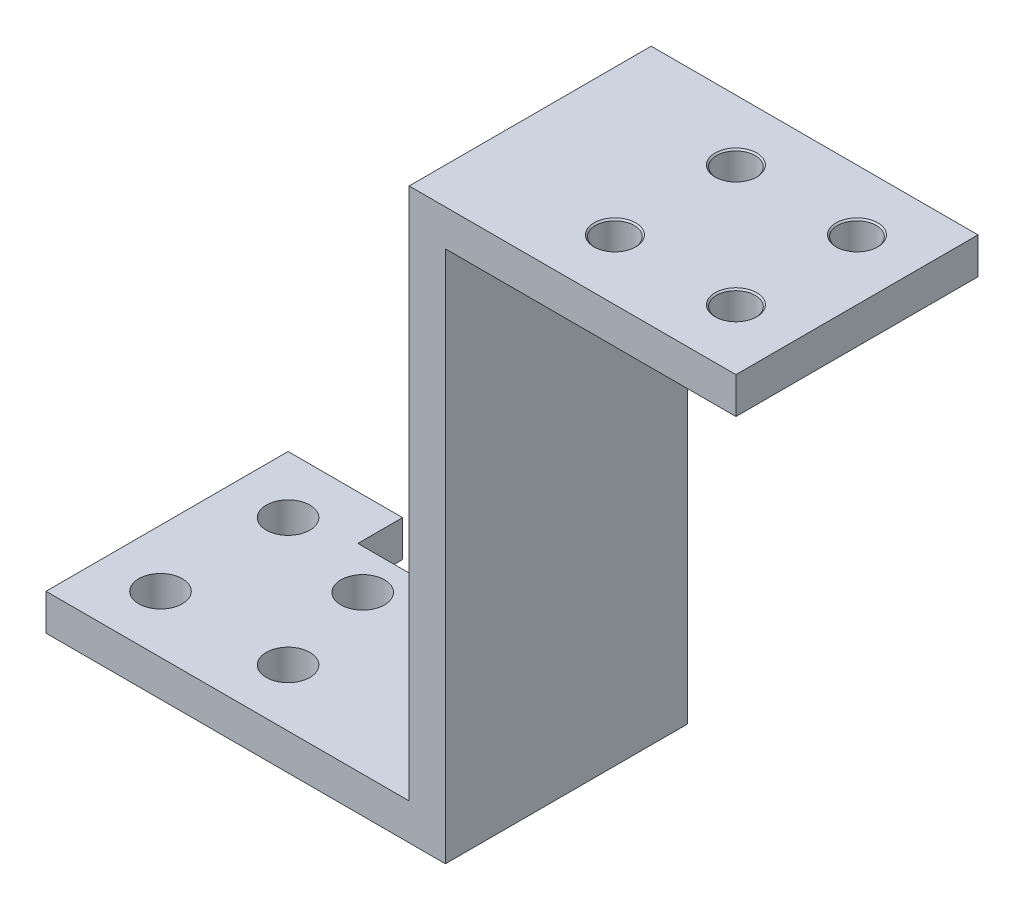
ISO-10303-21;
HEADER;
FILE_DESCRIPTION(('STEP AP214'),'2;1');
FILE_NAME('part.step','',(''),(''),'','','');
FILE_SCHEMA(('AUTOMOTIVE_DESIGN { 1 0 10303 214 1 1 1 1 }'));
ENDSEC;
DATA;
#1=APPLICATION_CONTEXT('core data for automotive mechanical design processes');
#2=APPLICATION_PROTOCOL_DEFINITION('international standard','automotive_design',2000,#1);
#3=PRODUCT_CONTEXT('',#1,'mechanical');
#4=PRODUCT('Part','Part','',(#3));
#5=PRODUCT_RELATED_PRODUCT_CATEGORY('part','',(#4));
#6=PRODUCT_DEFINITION_FORMATION('','',#4);
#7=PRODUCT_DEFINITION_CONTEXT('part definition',#1,'design');
#8=PRODUCT_DEFINITION('design','',#6,#7);
#9=PRODUCT_DEFINITION_SHAPE('','',#8);
#10=(LENGTH_UNIT() NAMED_UNIT(*) SI_UNIT(.MILLI.,.METRE.));
#11=(NAMED_UNIT(*) PLANE_ANGLE_UNIT() SI_UNIT($,.RADIAN.));
#12=(NAMED_UNIT(*) SI_UNIT($,.STERADIAN.) SOLID_ANGLE_UNIT());
#13=UNCERTAINTY_MEASURE_WITH_UNIT(LENGTH_MEASURE(1.E-05),#10,'distance_accuracy_value','');
#14=(GEOMETRIC_REPRESENTATION_CONTEXT(3) GLOBAL_UNCERTAINTY_ASSIGNED_CONTEXT((#13)) GLOBAL_UNIT_ASSIGNED_CONTEXT((#10,
#11,#12)) REPRESENTATION_CONTEXT('',''));
#15=CARTESIAN_POINT('',(0.,0.,0.));
#16=DIRECTION('',(0.,0.,1.));
#17=DIRECTION('',(1.,0.,0.));
#18=AXIS2_PLACEMENT_3D('',#15,#16,#17);
#19=CARTESIAN_POINT('',(0.,0.,0.));
#20=DIRECTION('',(0.,0.,1.));
#21=DIRECTION('',(-1.,0.,0.));
#22=AXIS2_PLACEMENT_3D('',#19,#20,#21);
#23=PLANE('',#22);
#24=DIRECTION('',(1.,0.,0.));
#25=VECTOR('',#24,1.);
#26=CARTESIAN_POINT('',(-57.,3.,0.));
#27=LINE('',#26,#25);
#28=CARTESIAN_POINT('',(-32.4508015476453,3.,0.));
#29=VERTEX_POINT('',#28);
#30=CARTESIAN_POINT('',(-27.,3.,0.));
#31=VERTEX_POINT('',#30);
#32=EDGE_CURVE('E171',#29,#31,#27,.T.);
#33=ORIENTED_EDGE('',*,*,#32,.T.);
#34=DIRECTION('',(0.,1.,0.));
#35=VECTOR('',#34,1.);
#36=CARTESIAN_POINT('',(-27.,3.,0.));
#37=LINE('',#36,#35);
#38=CARTESIAN_POINT('',(-27.,47.,0.));
#39=VERTEX_POINT('',#38);
#40=EDGE_CURVE('E136',#31,#39,#37,.T.);
#41=ORIENTED_EDGE('',*,*,#40,.T.);
#42=DIRECTION('',(1.,0.,0.));
#43=VECTOR('',#42,1.);
#44=CARTESIAN_POINT('',(-27.,47.,0.));
#45=LINE('',#44,#43);
#46=CARTESIAN_POINT('',(0.,47.,0.));
#47=VERTEX_POINT('',#46);
#48=EDGE_CURVE('E175',#39,#47,#45,.T.);
#49=ORIENTED_EDGE('',*,*,#48,.T.);
#50=DIRECTION('',(0.,-1.,0.));
#51=VECTOR('',#50,1.);
#52=CARTESIAN_POINT('',(0.,47.,0.));
#53=LINE('',#52,#51);
#54=CARTESIAN_POINT('',(0.,44.,0.));
#55=VERTEX_POINT('',#54);
#56=EDGE_CURVE('E154',#47,#55,#53,.T.);
#57=ORIENTED_EDGE('',*,*,#56,.T.);
#58=DIRECTION('',(-1.,0.,0.));
#59=VECTOR('',#58,1.);
#60=CARTESIAN_POINT('',(0.,44.,0.));
#61=LINE('',#60,#59);
#62=CARTESIAN_POINT('',(-24.,44.,0.));
#63=VERTEX_POINT('',#62);
#64=EDGE_CURVE('E157',#55,#63,#61,.T.);
#65=ORIENTED_EDGE('',*,*,#64,.T.);
#66=DIRECTION('',(0.,-1.,0.));
#67=VECTOR('',#66,1.);
#68=CARTESIAN_POINT('',(-24.,44.,0.));
#69=LINE('',#68,#67);
#70=CARTESIAN_POINT('',(-24.,0.,0.));
#71=VERTEX_POINT('',#70);
#72=EDGE_CURVE('E161',#63,#71,#69,.T.);
#73=ORIENTED_EDGE('',*,*,#72,.T.);
#74=DIRECTION('',(-1.,0.,0.));
#75=VECTOR('',#74,1.);
#76=CARTESIAN_POINT('',(-24.,0.,0.));
#77=LINE('',#76,#75);
#78=CARTESIAN_POINT('',(-32.4508015476453,0.,0.));
#79=VERTEX_POINT('',#78);
#80=EDGE_CURVE('E165',#71,#79,#77,.T.);
#81=ORIENTED_EDGE('',*,*,#80,.T.);
#82=DIRECTION('',(0.,1.,0.));
#83=VECTOR('',#82,1.);
#84=CARTESIAN_POINT('',(-32.4508015476453,0.,0.));
#85=LINE('',#84,#83);
#86=EDGE_CURVE('E272',#79,#29,#85,.T.);
#87=ORIENTED_EDGE('',*,*,#86,.T.);
#88=EDGE_LOOP('',(#33,#41,#49,#57,#65,#73,#81,#87));
#89=FACE_BOUND('',#88,.T.);
#90=ADVANCED_FACE('F43',(#89),#23,.F.);
#91=CARTESIAN_POINT('',(0.,47.,20.));
#92=DIRECTION('',(-1.,0.,0.));
#93=DIRECTION('',(0.,0.,-1.));
#94=AXIS2_PLACEMENT_3D('',#91,#92,#93);
#95=PLANE('',#94);
#96=ORIENTED_EDGE('',*,*,#56,.F.);
#97=DIRECTION('',(0.,0.,-1.));
#98=VECTOR('',#97,1.);
#99=CARTESIAN_POINT('',(0.,47.,20.));
#100=LINE('',#99,#98);
#101=CARTESIAN_POINT('',(0.,47.,20.));
#102=VERTEX_POINT('',#101);
#103=EDGE_CURVE('E99',#102,#47,#100,.T.);
#104=ORIENTED_EDGE('',*,*,#103,.F.);
#105=DIRECTION('',(0.,-1.,0.));
#106=VECTOR('',#105,1.);
#107=CARTESIAN_POINT('',(0.,47.,20.));
#108=LINE('',#107,#106);
#109=CARTESIAN_POINT('',(0.,44.,20.));
#110=VERTEX_POINT('',#109);
#111=EDGE_CURVE('E178',#102,#110,#108,.T.);
#112=ORIENTED_EDGE('',*,*,#111,.T.);
#113=DIRECTION('',(0.,0.,-1.));
#114=VECTOR('',#113,1.);
#115=CARTESIAN_POINT('',(0.,44.,20.));
#116=LINE('',#115,#114);
#117=EDGE_CURVE('E11',#110,#55,#116,.T.);
#118=ORIENTED_EDGE('',*,*,#117,.T.);
#119=EDGE_LOOP('',(#96,#104,#112,#118));
#120=FACE_BOUND('',#119,.T.);
#121=ADVANCED_FACE('F45',(#120),#95,.F.);
#122=CARTESIAN_POINT('',(0.,44.,20.));
#123=DIRECTION('',(0.,1.,0.));
#124=DIRECTION('',(0.,0.,1.));
#125=AXIS2_PLACEMENT_3D('',#122,#123,#124);
#126=PLANE('',#125);
#127=CARTESIAN_POINT('',(-4.99999999999999,44.,5.));
#128=DIRECTION('',(0.,-1.,0.));
#129=DIRECTION('',(0.,0.,1.));
#130=AXIS2_PLACEMENT_3D('',#127,#128,#129);
#131=CIRCLE('',#130,1.59999999999999);
#132=CARTESIAN_POINT('',(-4.99999999999999,44.,6.59999999999999));
#133=VERTEX_POINT('',#132);
#134=EDGE_CURVE('E47',#133,#133,#131,.T.);
#135=ORIENTED_EDGE('',*,*,#134,.F.);
#136=EDGE_LOOP('',(#135));
#137=FACE_BOUND('',#136,.T.);
#138=CARTESIAN_POINT('',(-4.99999999999999,44.,15.));
#139=DIRECTION('',(0.,-1.,0.));
#140=DIRECTION('',(0.,0.,1.));
#141=AXIS2_PLACEMENT_3D('',#138,#139,#140);
#142=CIRCLE('',#141,1.59999999999999);
#143=CARTESIAN_POINT('',(-4.99999999999999,44.,16.6));
#144=VERTEX_POINT('',#143);
#145=EDGE_CURVE('E195',#144,#144,#142,.T.);
#146=ORIENTED_EDGE('',*,*,#145,.F.);
#147=EDGE_LOOP('',(#146));
#148=FACE_BOUND('',#147,.T.);
#149=CARTESIAN_POINT('',(-15.,44.,5.));
#150=DIRECTION('',(0.,-1.,0.));
#151=DIRECTION('',(0.,0.,1.));
#152=AXIS2_PLACEMENT_3D('',#149,#150,#151);
#153=CIRCLE('',#152,1.59999999999999);
#154=CARTESIAN_POINT('',(-15.,44.,6.59999999999999));
#155=VERTEX_POINT('',#154);
#156=EDGE_CURVE('E191',#155,#155,#153,.T.);
#157=ORIENTED_EDGE('',*,*,#156,.F.);
#158=EDGE_LOOP('',(#157));
#159=FACE_BOUND('',#158,.T.);
#160=CARTESIAN_POINT('',(-15.,44.,15.));
#161=DIRECTION('',(0.,-1.,0.));
#162=DIRECTION('',(0.,0.,1.));
#163=AXIS2_PLACEMENT_3D('',#160,#161,#162);
#164=CIRCLE('',#163,1.59999999999999);
#165=CARTESIAN_POINT('',(-15.,44.,16.6));
#166=VERTEX_POINT('',#165);
#167=EDGE_CURVE('E158',#166,#166,#164,.T.);
#168=ORIENTED_EDGE('',*,*,#167,.F.);
#169=EDGE_LOOP('',(#168));
#170=FACE_BOUND('',#169,.T.);
#171=ORIENTED_EDGE('',*,*,#64,.F.);
#172=ORIENTED_EDGE('',*,*,#117,.F.);
#173=DIRECTION('',(-1.,0.,0.));
#174=VECTOR('',#173,1.);
#175=CARTESIAN_POINT('',(0.,44.,20.));
#176=LINE('',#175,#174);
#177=CARTESIAN_POINT('',(-24.,44.,20.));
#178=VERTEX_POINT('',#177);
#179=EDGE_CURVE('E107',#110,#178,#176,.T.);
#180=ORIENTED_EDGE('',*,*,#179,.T.);
#181=DIRECTION('',(0.,0.,-1.));
#182=VECTOR('',#181,1.);
#183=CARTESIAN_POINT('',(-24.,44.,20.));
#184=LINE('',#183,#182);
#185=EDGE_CURVE('E52',#178,#63,#184,.T.);
#186=ORIENTED_EDGE('',*,*,#185,.T.);
#187=EDGE_LOOP('',(#171,#172,#180,#186));
#188=FACE_BOUND('',#187,.T.);
#189=ADVANCED_FACE('F298',(#137,#148,#159,#170,#188),#126,.F.);
#190=CARTESIAN_POINT('',(-24.,44.,20.));
#191=DIRECTION('',(-1.,0.,0.));
#192=DIRECTION('',(0.,1.,0.));
#193=AXIS2_PLACEMENT_3D('',#190,#191,#192);
#194=PLANE('',#193);
#195=ORIENTED_EDGE('',*,*,#72,.F.);
#196=ORIENTED_EDGE('',*,*,#185,.F.);
#197=DIRECTION('',(0.,-1.,0.));
#198=VECTOR('',#197,1.);
#199=CARTESIAN_POINT('',(-24.,44.,20.));
#200=LINE('',#199,#198);
#201=CARTESIAN_POINT('',(-24.,0.,20.));
#202=VERTEX_POINT('',#201);
#203=EDGE_CURVE('E221',#178,#202,#200,.T.);
#204=ORIENTED_EDGE('',*,*,#203,.T.);
#205=DIRECTION('',(0.,0.,-1.));
#206=VECTOR('',#205,1.);
#207=CARTESIAN_POINT('',(-24.,0.,20.));
#208=LINE('',#207,#206);
#209=EDGE_CURVE('E185',#202,#71,#208,.T.);
#210=ORIENTED_EDGE('',*,*,#209,.T.);
#211=EDGE_LOOP('',(#195,#196,#204,#210));
#212=FACE_BOUND('',#211,.T.);
#213=ADVANCED_FACE('F301',(#212),#194,.F.);
#214=CARTESIAN_POINT('',(-24.,0.,20.));
#215=DIRECTION('',(0.,1.,0.));
#216=DIRECTION('',(0.,0.,1.));
#217=AXIS2_PLACEMENT_3D('',#214,#215,#216);
#218=PLANE('',#217);
#219=CARTESIAN_POINT('',(-41.7300999606955,0.,15.2699000393045));
#220=DIRECTION('',(0.,-1.,0.));
#221=DIRECTION('',(0.,0.,1.));
#222=AXIS2_PLACEMENT_3D('',#219,#220,#221);
#223=CIRCLE('',#222,1.8);
#224=CARTESIAN_POINT('',(-41.7300999606955,0.,17.0699000393045));
#225=VERTEX_POINT('',#224);
#226=EDGE_CURVE('E390',#225,#225,#223,.T.);
#227=ORIENTED_EDGE('',*,*,#226,.F.);
#228=EDGE_LOOP('',(#227));
#229=FACE_BOUND('',#228,.T.);
#230=CARTESIAN_POINT('',(-52.2699000393045,0.,15.2699000393045));
#231=DIRECTION('',(0.,-1.,0.));
#232=DIRECTION('',(0.,0.,1.));
#233=AXIS2_PLACEMENT_3D('',#230,#231,#232);
#234=CIRCLE('',#233,1.8);
#235=CARTESIAN_POINT('',(-52.2699000393045,0.,17.0699000393045));
#236=VERTEX_POINT('',#235);
#237=EDGE_CURVE('E401',#236,#236,#234,.T.);
#238=ORIENTED_EDGE('',*,*,#237,.F.);
#239=EDGE_LOOP('',(#238));
#240=FACE_BOUND('',#239,.T.);
#241=CARTESIAN_POINT('',(-52.2699000393045,0.,4.73009996069547));
#242=DIRECTION('',(0.,-1.,0.));
#243=DIRECTION('',(0.,0.,1.));
#244=AXIS2_PLACEMENT_3D('',#241,#242,#243);
#245=CIRCLE('',#244,1.8);
#246=CARTESIAN_POINT('',(-52.2699000393045,0.,6.53009996069546));
#247=VERTEX_POINT('',#246);
#248=EDGE_CURVE('E407',#247,#247,#245,.T.);
#249=ORIENTED_EDGE('',*,*,#248,.F.);
#250=EDGE_LOOP('',(#249));
#251=FACE_BOUND('',#250,.T.);
#252=CARTESIAN_POINT('',(-36.1508015476453,0.,6.99558979075441));
#253=DIRECTION('',(0.,-1.,0.));
#254=DIRECTION('',(0.,0.,1.));
#255=AXIS2_PLACEMENT_3D('',#252,#253,#254);
#256=CIRCLE('',#255,1.8);
#257=CARTESIAN_POINT('',(-36.1508015476453,0.,8.79558979075441));
#258=VERTEX_POINT('',#257);
#259=EDGE_CURVE('E413',#258,#258,#256,.T.);
#260=ORIENTED_EDGE('',*,*,#259,.F.);
#261=EDGE_LOOP('',(#260));
#262=FACE_BOUND('',#261,.T.);
#263=CARTESIAN_POINT('',(-43.8398000786091,0.,6.99558979075443));
#264=DIRECTION('',(0.,-1.,0.));
#265=DIRECTION('',(0.,0.,1.));
#266=AXIS2_PLACEMENT_3D('',#263,#264,#265);
#267=CIRCLE('',#266,1.8);
#268=CARTESIAN_POINT('',(-43.8398000786091,0.,8.79558979075443));
#269=VERTEX_POINT('',#268);
#270=EDGE_CURVE('E280',#269,#269,#267,.T.);
#271=ORIENTED_EDGE('',*,*,#270,.F.);
#272=EDGE_LOOP('',(#271));
#273=FACE_BOUND('',#272,.T.);
#274=ORIENTED_EDGE('',*,*,#80,.F.);
#275=ORIENTED_EDGE('',*,*,#209,.F.);
#276=DIRECTION('',(-1.,0.,0.));
#277=VECTOR('',#276,1.);
#278=CARTESIAN_POINT('',(-24.,0.,20.));
#279=LINE('',#278,#277);
#280=CARTESIAN_POINT('',(-57.,0.,20.));
#281=VERTEX_POINT('',#280);
#282=EDGE_CURVE('E149',#202,#281,#279,.T.);
#283=ORIENTED_EDGE('',*,*,#282,.T.);
#284=DIRECTION('',(0.,0.,-1.));
#285=VECTOR('',#284,1.);
#286=CARTESIAN_POINT('',(-57.,0.,20.));
#287=LINE('',#286,#285);
#288=CARTESIAN_POINT('',(-57.,0.,0.));
#289=VERTEX_POINT('',#288);
#290=EDGE_CURVE('E182',#281,#289,#287,.T.);
#291=ORIENTED_EDGE('',*,*,#290,.T.);
#292=CARTESIAN_POINT('',(-47.5398000786091,0.,0.));
#293=VERTEX_POINT('',#292);
#294=EDGE_CURVE('E164',#293,#289,#77,.T.);
#295=ORIENTED_EDGE('',*,*,#294,.F.);
#296=DIRECTION('',(0.,0.,-1.));
#297=VECTOR('',#296,1.);
#298=CARTESIAN_POINT('',(-47.5398000786091,0.,0.));
#299=LINE('',#298,#297);
#300=CARTESIAN_POINT('',(-47.5398000786091,0.,3.69558979075439));
#301=VERTEX_POINT('',#300);
#302=EDGE_CURVE('E240',#301,#293,#299,.T.);
#303=ORIENTED_EDGE('',*,*,#302,.F.);
#304=DIRECTION('',(-1.,0.,0.));
#305=VECTOR('',#304,1.);
#306=CARTESIAN_POINT('',(-32.4508015476453,0.,3.69558979075439));
#307=LINE('',#306,#305);
#308=CARTESIAN_POINT('',(-32.4508015476453,0.,3.69558979075439));
#309=VERTEX_POINT('',#308);
#310=EDGE_CURVE('E267',#309,#301,#307,.T.);
#311=ORIENTED_EDGE('',*,*,#310,.F.);
#312=DIRECTION('',(0.,0.,1.));
#313=VECTOR('',#312,1.);
#314=CARTESIAN_POINT('',(-32.4508015476453,0.,0.));
#315=LINE('',#314,#313);
#316=EDGE_CURVE('E270',#79,#309,#315,.T.);
#317=ORIENTED_EDGE('',*,*,#316,.F.);
#318=EDGE_LOOP('',(#274,#275,#283,#291,#295,#303,#311,#317));
#319=FACE_BOUND('',#318,.T.);
#320=ADVANCED_FACE('F227',(#229,#240,#251,#262,#273,#319),#218,.F.);
#321=CARTESIAN_POINT('',(-57.,0.,20.));
#322=DIRECTION('',(1.,0.,0.));
#323=DIRECTION('',(0.,-1.,0.));
#324=AXIS2_PLACEMENT_3D('',#321,#322,#323);
#325=PLANE('',#324);
#326=DIRECTION('',(0.,1.,0.));
#327=VECTOR('',#326,1.);
#328=CARTESIAN_POINT('',(-57.,0.,0.));
#329=LINE('',#328,#327);
#330=CARTESIAN_POINT('',(-57.,3.,0.));
#331=VERTEX_POINT('',#330);
#332=EDGE_CURVE('E168',#289,#331,#329,.T.);
#333=ORIENTED_EDGE('',*,*,#332,.F.);
#334=ORIENTED_EDGE('',*,*,#290,.F.);
#335=DIRECTION('',(0.,1.,0.));
#336=VECTOR('',#335,1.);
#337=CARTESIAN_POINT('',(-57.,0.,20.));
#338=LINE('',#337,#336);
#339=CARTESIAN_POINT('',(-57.,3.,20.));
#340=VERTEX_POINT('',#339);
#341=EDGE_CURVE('E147',#281,#340,#338,.T.);
#342=ORIENTED_EDGE('',*,*,#341,.T.);
#343=DIRECTION('',(0.,0.,-1.));
#344=VECTOR('',#343,1.);
#345=CARTESIAN_POINT('',(-57.,3.,20.));
#346=LINE('',#345,#344);
#347=EDGE_CURVE('E140',#340,#331,#346,.T.);
#348=ORIENTED_EDGE('',*,*,#347,.T.);
#349=EDGE_LOOP('',(#333,#334,#342,#348));
#350=FACE_BOUND('',#349,.T.);
#351=ADVANCED_FACE('F232',(#350),#325,.F.);
#352=CARTESIAN_POINT('',(-57.,3.,20.));
#353=DIRECTION('',(0.,-1.,0.));
#354=DIRECTION('',(-1.,0.,0.));
#355=AXIS2_PLACEMENT_3D('',#352,#353,#354);
#356=PLANE('',#355);
#357=CARTESIAN_POINT('',(-41.7300999606955,3.,15.2699000393045));
#358=DIRECTION('',(0.,-1.,0.));
#359=DIRECTION('',(0.,0.,1.));
#360=AXIS2_PLACEMENT_3D('',#357,#358,#359);
#361=CIRCLE('',#360,1.79999999999999);
#362=CARTESIAN_POINT('',(-41.7300999606955,3.,17.0699000393045));
#363=VERTEX_POINT('',#362);
#364=EDGE_CURVE('E393',#363,#363,#361,.T.);
#365=ORIENTED_EDGE('',*,*,#364,.T.);
#366=EDGE_LOOP('',(#365));
#367=FACE_BOUND('',#366,.T.);
#368=CARTESIAN_POINT('',(-52.2699000393045,3.,15.2699000393045));
#369=DIRECTION('',(0.,-1.,0.));
#370=DIRECTION('',(0.,0.,1.));
#371=AXIS2_PLACEMENT_3D('',#368,#369,#370);
#372=CIRCLE('',#371,1.79999999999999);
#373=CARTESIAN_POINT('',(-52.2699000393045,3.,17.0699000393045));
#374=VERTEX_POINT('',#373);
#375=EDGE_CURVE('E396',#374,#374,#372,.T.);
#376=ORIENTED_EDGE('',*,*,#375,.T.);
#377=EDGE_LOOP('',(#376));
#378=FACE_BOUND('',#377,.T.);
#379=CARTESIAN_POINT('',(-52.2699000393045,3.,4.73009996069547));
#380=DIRECTION('',(0.,-1.,0.));
#381=DIRECTION('',(0.,0.,1.));
#382=AXIS2_PLACEMENT_3D('',#379,#380,#381);
#383=CIRCLE('',#382,1.79999999999999);
#384=CARTESIAN_POINT('',(-52.2699000393045,3.,6.53009996069546));
#385=VERTEX_POINT('',#384);
#386=EDGE_CURVE('E404',#385,#385,#383,.T.);
#387=ORIENTED_EDGE('',*,*,#386,.T.);
#388=EDGE_LOOP('',(#387));
#389=FACE_BOUND('',#388,.T.);
#390=CARTESIAN_POINT('',(-36.1508015476453,3.,6.99558979075441));
#391=DIRECTION('',(0.,-1.,0.));
#392=DIRECTION('',(0.,0.,1.));
#393=AXIS2_PLACEMENT_3D('',#390,#391,#392);
#394=CIRCLE('',#393,1.8);
#395=CARTESIAN_POINT('',(-36.1508015476453,3.,8.79558979075441));
#396=VERTEX_POINT('',#395);
#397=EDGE_CURVE('E410',#396,#396,#394,.T.);
#398=ORIENTED_EDGE('',*,*,#397,.T.);
#399=EDGE_LOOP('',(#398));
#400=FACE_BOUND('',#399,.T.);
#401=CARTESIAN_POINT('',(-43.8398000786091,3.,6.99558979075443));
#402=DIRECTION('',(0.,-1.,0.));
#403=DIRECTION('',(0.,0.,1.));
#404=AXIS2_PLACEMENT_3D('',#401,#402,#403);
#405=CIRCLE('',#404,1.8);
#406=CARTESIAN_POINT('',(-43.8398000786091,3.,8.79558979075443));
#407=VERTEX_POINT('',#406);
#408=EDGE_CURVE('E416',#407,#407,#405,.T.);
#409=ORIENTED_EDGE('',*,*,#408,.T.);
#410=EDGE_LOOP('',(#409));
#411=FACE_BOUND('',#410,.T.);
#412=DIRECTION('',(-1.,0.,0.));
#413=VECTOR('',#412,1.);
#414=CARTESIAN_POINT('',(-32.4508015476453,3.,3.69558979075439));
#415=LINE('',#414,#413);
#416=CARTESIAN_POINT('',(-32.4508015476453,3.,3.69558979075439));
#417=VERTEX_POINT('',#416);
#418=CARTESIAN_POINT('',(-47.5398000786091,3.,3.69558979075439));
#419=VERTEX_POINT('',#418);
#420=EDGE_CURVE('E268',#417,#419,#415,.T.);
#421=ORIENTED_EDGE('',*,*,#420,.T.);
#422=DIRECTION('',(0.,0.,-1.));
#423=VECTOR('',#422,1.);
#424=CARTESIAN_POINT('',(-47.5398000786091,3.,0.));
#425=LINE('',#424,#423);
#426=CARTESIAN_POINT('',(-47.5398000786091,3.,0.));
#427=VERTEX_POINT('',#426);
#428=EDGE_CURVE('E273',#419,#427,#425,.T.);
#429=ORIENTED_EDGE('',*,*,#428,.T.);
#430=EDGE_CURVE('E172',#331,#427,#27,.T.);
#431=ORIENTED_EDGE('',*,*,#430,.F.);
#432=ORIENTED_EDGE('',*,*,#347,.F.);
#433=DIRECTION('',(1.,0.,0.));
#434=VECTOR('',#433,1.);
#435=CARTESIAN_POINT('',(-57.,3.,20.));
#436=LINE('',#435,#434);
#437=CARTESIAN_POINT('',(-27.,3.,20.));
#438=VERTEX_POINT('',#437);
#439=EDGE_CURVE('E128',#340,#438,#436,.T.);
#440=ORIENTED_EDGE('',*,*,#439,.T.);
#441=DIRECTION('',(0.,0.,-1.));
#442=VECTOR('',#441,1.);
#443=CARTESIAN_POINT('',(-27.,3.,20.));
#444=LINE('',#443,#442);
#445=EDGE_CURVE('E133',#438,#31,#444,.T.);
#446=ORIENTED_EDGE('',*,*,#445,.T.);
#447=ORIENTED_EDGE('',*,*,#32,.F.);
#448=DIRECTION('',(0.,0.,1.));
#449=VECTOR('',#448,1.);
#450=CARTESIAN_POINT('',(-32.4508015476453,3.,0.));
#451=LINE('',#450,#449);
#452=EDGE_CURVE('E261',#29,#417,#451,.T.);
#453=ORIENTED_EDGE('',*,*,#452,.T.);
#454=EDGE_LOOP('',(#421,#429,#431,#432,#440,#446,#447,#453));
#455=FACE_BOUND('',#454,.T.);
#456=ADVANCED_FACE('F144',(#367,#378,#389,#400,#411,#455),#356,.F.);
#457=CARTESIAN_POINT('',(-27.,3.,20.));
#458=DIRECTION('',(1.,0.,0.));
#459=DIRECTION('',(0.,-1.,0.));
#460=AXIS2_PLACEMENT_3D('',#457,#458,#459);
#461=PLANE('',#460);
#462=ORIENTED_EDGE('',*,*,#40,.F.);
#463=ORIENTED_EDGE('',*,*,#445,.F.);
#464=DIRECTION('',(0.,1.,0.));
#465=VECTOR('',#464,1.);
#466=CARTESIAN_POINT('',(-27.,3.,20.));
#467=LINE('',#466,#465);
#468=CARTESIAN_POINT('',(-27.,47.,20.));
#469=VERTEX_POINT('',#468);
#470=EDGE_CURVE('E124',#438,#469,#467,.T.);
#471=ORIENTED_EDGE('',*,*,#470,.T.);
#472=DIRECTION('',(0.,0.,-1.));
#473=VECTOR('',#472,1.);
#474=CARTESIAN_POINT('',(-27.,47.,20.));
#475=LINE('',#474,#473);
#476=EDGE_CURVE('E141',#469,#39,#475,.T.);
#477=ORIENTED_EDGE('',*,*,#476,.T.);
#478=EDGE_LOOP('',(#462,#463,#471,#477));
#479=FACE_BOUND('',#478,.T.);
#480=ADVANCED_FACE('F134',(#479),#461,.F.);
#481=CARTESIAN_POINT('',(-27.,47.,20.));
#482=DIRECTION('',(0.,-1.,0.));
#483=DIRECTION('',(-1.,0.,0.));
#484=AXIS2_PLACEMENT_3D('',#481,#482,#483);
#485=PLANE('',#484);
#486=CARTESIAN_POINT('',(-4.99999999999999,47.,5.));
#487=DIRECTION('',(0.,-1.,0.));
#488=DIRECTION('',(0.,0.,1.));
#489=AXIS2_PLACEMENT_3D('',#486,#487,#488);
#490=CIRCLE('',#489,1.725);
#491=CARTESIAN_POINT('',(-4.99999999999999,47.,6.725));
#492=VERTEX_POINT('',#491);
#493=EDGE_CURVE('E285',#492,#492,#490,.T.);
#494=ORIENTED_EDGE('',*,*,#493,.T.);
#495=EDGE_LOOP('',(#494));
#496=FACE_BOUND('',#495,.T.);
#497=CARTESIAN_POINT('',(-4.99999999999999,47.,15.));
#498=DIRECTION('',(0.,-1.,0.));
#499=DIRECTION('',(0.,0.,1.));
#500=AXIS2_PLACEMENT_3D('',#497,#498,#499);
#501=CIRCLE('',#500,1.725);
#502=CARTESIAN_POINT('',(-4.99999999999999,47.,16.725));
#503=VERTEX_POINT('',#502);
#504=EDGE_CURVE('E204',#503,#503,#501,.T.);
#505=ORIENTED_EDGE('',*,*,#504,.T.);
#506=EDGE_LOOP('',(#505));
#507=FACE_BOUND('',#506,.T.);
#508=CARTESIAN_POINT('',(-15.,47.,5.));
#509=DIRECTION('',(0.,-1.,0.));
#510=DIRECTION('',(0.,0.,1.));
#511=AXIS2_PLACEMENT_3D('',#508,#509,#510);
#512=CIRCLE('',#511,1.725);
#513=CARTESIAN_POINT('',(-15.,47.,6.725));
#514=VERTEX_POINT('',#513);
#515=EDGE_CURVE('E197',#514,#514,#512,.T.);
#516=ORIENTED_EDGE('',*,*,#515,.T.);
#517=EDGE_LOOP('',(#516));
#518=FACE_BOUND('',#517,.T.);
#519=CARTESIAN_POINT('',(-15.,47.,15.));
#520=DIRECTION('',(0.,-1.,0.));
#521=DIRECTION('',(0.,0.,1.));
#522=AXIS2_PLACEMENT_3D('',#519,#520,#521);
#523=CIRCLE('',#522,1.725);
#524=CARTESIAN_POINT('',(-15.,47.,16.725));
#525=VERTEX_POINT('',#524);
#526=EDGE_CURVE('E193',#525,#525,#523,.T.);
#527=ORIENTED_EDGE('',*,*,#526,.T.);
#528=EDGE_LOOP('',(#527));
#529=FACE_BOUND('',#528,.T.);
#530=ORIENTED_EDGE('',*,*,#48,.F.);
#531=ORIENTED_EDGE('',*,*,#476,.F.);
#532=DIRECTION('',(1.,0.,0.));
#533=VECTOR('',#532,1.);
#534=CARTESIAN_POINT('',(-27.,47.,20.));
#535=LINE('',#534,#533);
#536=EDGE_CURVE('E69',#469,#102,#535,.T.);
#537=ORIENTED_EDGE('',*,*,#536,.T.);
#538=ORIENTED_EDGE('',*,*,#103,.T.);
#539=EDGE_LOOP('',(#530,#531,#537,#538));
#540=FACE_BOUND('',#539,.T.);
#541=ADVANCED_FACE('F329',(#496,#507,#518,#529,#540),#485,.F.);
#542=CARTESIAN_POINT('',(0.,0.,20.));
#543=DIRECTION('',(0.,0.,1.));
#544=DIRECTION('',(-1.,0.,0.));
#545=AXIS2_PLACEMENT_3D('',#542,#543,#544);
#546=PLANE('',#545);
#547=ORIENTED_EDGE('',*,*,#111,.F.);
#548=ORIENTED_EDGE('',*,*,#536,.F.);
#549=ORIENTED_EDGE('',*,*,#470,.F.);
#550=ORIENTED_EDGE('',*,*,#439,.F.);
#551=ORIENTED_EDGE('',*,*,#341,.F.);
#552=ORIENTED_EDGE('',*,*,#282,.F.);
#553=ORIENTED_EDGE('',*,*,#203,.F.);
#554=ORIENTED_EDGE('',*,*,#179,.F.);
#555=EDGE_LOOP('',(#547,#548,#549,#550,#551,#552,#553,#554));
#556=FACE_BOUND('',#555,.T.);
#557=ADVANCED_FACE('F126',(#556),#546,.T.);
#558=ORIENTED_EDGE('',*,*,#294,.T.);
#559=ORIENTED_EDGE('',*,*,#332,.T.);
#560=ORIENTED_EDGE('',*,*,#430,.T.);
#561=DIRECTION('',(0.,1.,0.));
#562=VECTOR('',#561,1.);
#563=CARTESIAN_POINT('',(-47.5398000786091,0.,0.));
#564=LINE('',#563,#562);
#565=EDGE_CURVE('E60',#293,#427,#564,.T.);
#566=ORIENTED_EDGE('',*,*,#565,.F.);
#567=EDGE_LOOP('',(#558,#559,#560,#566));
#568=FACE_BOUND('',#567,.T.);
#569=ADVANCED_FACE('F235',(#568),#23,.F.);
#570=CARTESIAN_POINT('',(-15.,47.,15.));
#571=DIRECTION('',(0.,1.,0.));
#572=DIRECTION('',(0.,0.,1.));
#573=AXIS2_PLACEMENT_3D('',#570,#571,#572);
#574=CYLINDRICAL_SURFACE('',#573,1.59999999999999);
#575=CARTESIAN_POINT('',(-15.,46.875,15.));
#576=DIRECTION('',(0.,-1.,0.));
#577=DIRECTION('',(0.,0.,1.));
#578=AXIS2_PLACEMENT_3D('',#575,#576,#577);
#579=CIRCLE('',#578,1.59999999999999);
#580=CARTESIAN_POINT('',(-15.,46.875,16.6));
#581=VERTEX_POINT('',#580);
#582=EDGE_CURVE('E190',#581,#581,#579,.T.);
#583=ORIENTED_EDGE('',*,*,#582,.F.);
#584=EDGE_LOOP('',(#583));
#585=FACE_BOUND('',#584,.T.);
#586=ORIENTED_EDGE('',*,*,#167,.T.);
#587=EDGE_LOOP('',(#586));
#588=FACE_BOUND('',#587,.T.);
#589=ADVANCED_FACE('F321',(#585,#588),#574,.F.);
#590=CARTESIAN_POINT('',(-15.,47.,15.));
#591=DIRECTION('',(0.,1.,0.));
#592=DIRECTION('',(0.,0.,1.));
#593=AXIS2_PLACEMENT_3D('',#590,#591,#592);
#594=CONICAL_SURFACE('',#593,1.725,0.785398163397448);
#595=ORIENTED_EDGE('',*,*,#582,.T.);
#596=EDGE_LOOP('',(#595));
#597=FACE_BOUND('',#596,.T.);
#598=ORIENTED_EDGE('',*,*,#526,.F.);
#599=EDGE_LOOP('',(#598));
#600=FACE_BOUND('',#599,.T.);
#601=ADVANCED_FACE('F326',(#597,#600),#594,.F.);
#602=CARTESIAN_POINT('',(-15.,47.,5.));
#603=DIRECTION('',(0.,1.,0.));
#604=DIRECTION('',(0.,0.,1.));
#605=AXIS2_PLACEMENT_3D('',#602,#603,#604);
#606=CYLINDRICAL_SURFACE('',#605,1.59999999999999);
#607=CARTESIAN_POINT('',(-15.,46.875,5.));
#608=DIRECTION('',(0.,-1.,0.));
#609=DIRECTION('',(0.,0.,1.));
#610=AXIS2_PLACEMENT_3D('',#607,#608,#609);
#611=CIRCLE('',#610,1.59999999999999);
#612=CARTESIAN_POINT('',(-15.,46.875,6.59999999999999));
#613=VERTEX_POINT('',#612);
#614=EDGE_CURVE('E194',#613,#613,#611,.T.);
#615=ORIENTED_EDGE('',*,*,#614,.F.);
#616=EDGE_LOOP('',(#615));
#617=FACE_BOUND('',#616,.T.);
#618=ORIENTED_EDGE('',*,*,#156,.T.);
#619=EDGE_LOOP('',(#618));
#620=FACE_BOUND('',#619,.T.);
#621=ADVANCED_FACE('F337',(#617,#620),#606,.F.);
#622=CARTESIAN_POINT('',(-15.,47.,5.));
#623=DIRECTION('',(0.,1.,0.));
#624=DIRECTION('',(0.,0.,1.));
#625=AXIS2_PLACEMENT_3D('',#622,#623,#624);
#626=CONICAL_SURFACE('',#625,1.725,0.785398163397448);
#627=ORIENTED_EDGE('',*,*,#614,.T.);
#628=EDGE_LOOP('',(#627));
#629=FACE_BOUND('',#628,.T.);
#630=ORIENTED_EDGE('',*,*,#515,.F.);
#631=EDGE_LOOP('',(#630));
#632=FACE_BOUND('',#631,.T.);
#633=ADVANCED_FACE('F341',(#629,#632),#626,.F.);
#634=CARTESIAN_POINT('',(-4.99999999999999,47.,15.));
#635=DIRECTION('',(0.,1.,0.));
#636=DIRECTION('',(0.,0.,1.));
#637=AXIS2_PLACEMENT_3D('',#634,#635,#636);
#638=CYLINDRICAL_SURFACE('',#637,1.59999999999999);
#639=CARTESIAN_POINT('',(-4.99999999999999,46.875,15.));
#640=DIRECTION('',(0.,-1.,0.));
#641=DIRECTION('',(0.,0.,1.));
#642=AXIS2_PLACEMENT_3D('',#639,#640,#641);
#643=CIRCLE('',#642,1.59999999999999);
#644=CARTESIAN_POINT('',(-4.99999999999999,46.875,16.6));
#645=VERTEX_POINT('',#644);
#646=EDGE_CURVE('E198',#645,#645,#643,.T.);
#647=ORIENTED_EDGE('',*,*,#646,.F.);
#648=EDGE_LOOP('',(#647));
#649=FACE_BOUND('',#648,.T.);
#650=ORIENTED_EDGE('',*,*,#145,.T.);
#651=EDGE_LOOP('',(#650));
#652=FACE_BOUND('',#651,.T.);
#653=ADVANCED_FACE('F345',(#649,#652),#638,.F.);
#654=CARTESIAN_POINT('',(-4.99999999999999,47.,15.));
#655=DIRECTION('',(0.,1.,0.));
#656=DIRECTION('',(0.,0.,1.));
#657=AXIS2_PLACEMENT_3D('',#654,#655,#656);
#658=CONICAL_SURFACE('',#657,1.725,0.785398163397448);
#659=ORIENTED_EDGE('',*,*,#646,.T.);
#660=EDGE_LOOP('',(#659));
#661=FACE_BOUND('',#660,.T.);
#662=ORIENTED_EDGE('',*,*,#504,.F.);
#663=EDGE_LOOP('',(#662));
#664=FACE_BOUND('',#663,.T.);
#665=ADVANCED_FACE('F349',(#661,#664),#658,.F.);
#666=CARTESIAN_POINT('',(-4.99999999999999,47.,5.));
#667=DIRECTION('',(0.,1.,0.));
#668=DIRECTION('',(0.,0.,1.));
#669=AXIS2_PLACEMENT_3D('',#666,#667,#668);
#670=CYLINDRICAL_SURFACE('',#669,1.59999999999999);
#671=CARTESIAN_POINT('',(-4.99999999999999,46.875,5.));
#672=DIRECTION('',(0.,-1.,0.));
#673=DIRECTION('',(0.,0.,1.));
#674=AXIS2_PLACEMENT_3D('',#671,#672,#673);
#675=CIRCLE('',#674,1.59999999999999);
#676=CARTESIAN_POINT('',(-4.99999999999999,46.875,6.59999999999999));
#677=VERTEX_POINT('',#676);
#678=EDGE_CURVE('E289',#677,#677,#675,.T.);
#679=ORIENTED_EDGE('',*,*,#678,.F.);
#680=EDGE_LOOP('',(#679));
#681=FACE_BOUND('',#680,.T.);
#682=ORIENTED_EDGE('',*,*,#134,.T.);
#683=EDGE_LOOP('',(#682));
#684=FACE_BOUND('',#683,.T.);
#685=ADVANCED_FACE('F296',(#681,#684),#670,.F.);
#686=CARTESIAN_POINT('',(-4.99999999999999,47.,5.));
#687=DIRECTION('',(0.,1.,0.));
#688=DIRECTION('',(0.,0.,1.));
#689=AXIS2_PLACEMENT_3D('',#686,#687,#688);
#690=CONICAL_SURFACE('',#689,1.725,0.785398163397448);
#691=ORIENTED_EDGE('',*,*,#678,.T.);
#692=EDGE_LOOP('',(#691));
#693=FACE_BOUND('',#692,.T.);
#694=ORIENTED_EDGE('',*,*,#493,.F.);
#695=EDGE_LOOP('',(#694));
#696=FACE_BOUND('',#695,.T.);
#697=ADVANCED_FACE('F355',(#693,#696),#690,.F.);
#698=CARTESIAN_POINT('',(-32.4508015476453,0.,0.));
#699=DIRECTION('',(1.,0.,0.));
#700=DIRECTION('',(0.,0.,1.));
#701=AXIS2_PLACEMENT_3D('',#698,#699,#700);
#702=PLANE('',#701);
#703=ORIENTED_EDGE('',*,*,#452,.F.);
#704=ORIENTED_EDGE('',*,*,#86,.F.);
#705=ORIENTED_EDGE('',*,*,#316,.T.);
#706=DIRECTION('',(0.,1.,0.));
#707=VECTOR('',#706,1.);
#708=CARTESIAN_POINT('',(-32.4508015476453,0.,3.69558979075439));
#709=LINE('',#708,#707);
#710=EDGE_CURVE('E264',#309,#417,#709,.T.);
#711=ORIENTED_EDGE('',*,*,#710,.T.);
#712=EDGE_LOOP('',(#703,#704,#705,#711));
#713=FACE_BOUND('',#712,.T.);
#714=ADVANCED_FACE('F271',(#713),#702,.F.);
#715=CARTESIAN_POINT('',(-47.5398000786091,0.,0.));
#716=DIRECTION('',(-1.,0.,0.));
#717=DIRECTION('',(0.,0.,-1.));
#718=AXIS2_PLACEMENT_3D('',#715,#716,#717);
#719=PLANE('',#718);
#720=ORIENTED_EDGE('',*,*,#428,.F.);
#721=DIRECTION('',(0.,1.,0.));
#722=VECTOR('',#721,1.);
#723=CARTESIAN_POINT('',(-47.5398000786091,0.,3.69558979075439));
#724=LINE('',#723,#722);
#725=EDGE_CURVE('E256',#301,#419,#724,.T.);
#726=ORIENTED_EDGE('',*,*,#725,.F.);
#727=ORIENTED_EDGE('',*,*,#302,.T.);
#728=ORIENTED_EDGE('',*,*,#565,.T.);
#729=EDGE_LOOP('',(#720,#726,#727,#728));
#730=FACE_BOUND('',#729,.T.);
#731=ADVANCED_FACE('F361',(#730),#719,.F.);
#732=CARTESIAN_POINT('',(-32.4508015476453,0.,3.69558979075439));
#733=DIRECTION('',(0.,0.,1.));
#734=DIRECTION('',(-1.,0.,0.));
#735=AXIS2_PLACEMENT_3D('',#732,#733,#734);
#736=PLANE('',#735);
#737=ORIENTED_EDGE('',*,*,#420,.F.);
#738=ORIENTED_EDGE('',*,*,#710,.F.);
#739=ORIENTED_EDGE('',*,*,#310,.T.);
#740=ORIENTED_EDGE('',*,*,#725,.T.);
#741=EDGE_LOOP('',(#737,#738,#739,#740));
#742=FACE_BOUND('',#741,.T.);
#743=ADVANCED_FACE('F266',(#742),#736,.F.);
#744=CARTESIAN_POINT('',(-43.8398000786091,3.,6.99558979075443));
#745=DIRECTION('',(0.,1.,0.));
#746=DIRECTION('',(0.,0.,1.));
#747=AXIS2_PLACEMENT_3D('',#744,#745,#746);
#748=CYLINDRICAL_SURFACE('',#747,1.8);
#749=ORIENTED_EDGE('',*,*,#270,.T.);
#750=EDGE_LOOP('',(#749));
#751=FACE_BOUND('',#750,.T.);
#752=ORIENTED_EDGE('',*,*,#408,.F.);
#753=EDGE_LOOP('',(#752));
#754=FACE_BOUND('',#753,.T.);
#755=ADVANCED_FACE('F364',(#751,#754),#748,.F.);
#756=CARTESIAN_POINT('',(-36.1508015476453,3.,6.99558979075441));
#757=DIRECTION('',(0.,1.,0.));
#758=DIRECTION('',(0.,0.,1.));
#759=AXIS2_PLACEMENT_3D('',#756,#757,#758);
#760=CYLINDRICAL_SURFACE('',#759,1.8);
#761=ORIENTED_EDGE('',*,*,#259,.T.);
#762=EDGE_LOOP('',(#761));
#763=FACE_BOUND('',#762,.T.);
#764=ORIENTED_EDGE('',*,*,#397,.F.);
#765=EDGE_LOOP('',(#764));
#766=FACE_BOUND('',#765,.T.);
#767=ADVANCED_FACE('F369',(#763,#766),#760,.F.);
#768=CARTESIAN_POINT('',(-52.2699000393045,3.,4.73009996069547));
#769=DIRECTION('',(0.,1.,0.));
#770=DIRECTION('',(0.,0.,1.));
#771=AXIS2_PLACEMENT_3D('',#768,#769,#770);
#772=CYLINDRICAL_SURFACE('',#771,1.79999999999999);
#773=ORIENTED_EDGE('',*,*,#248,.T.);
#774=EDGE_LOOP('',(#773));
#775=FACE_BOUND('',#774,.T.);
#776=ORIENTED_EDGE('',*,*,#386,.F.);
#777=EDGE_LOOP('',(#776));
#778=FACE_BOUND('',#777,.T.);
#779=ADVANCED_FACE('F373',(#775,#778),#772,.F.);
#780=CARTESIAN_POINT('',(-52.2699000393045,3.,15.2699000393045));
#781=DIRECTION('',(0.,1.,0.));
#782=DIRECTION('',(0.,0.,1.));
#783=AXIS2_PLACEMENT_3D('',#780,#781,#782);
#784=CYLINDRICAL_SURFACE('',#783,1.79999999999999);
#785=ORIENTED_EDGE('',*,*,#237,.T.);
#786=EDGE_LOOP('',(#785));
#787=FACE_BOUND('',#786,.T.);
#788=ORIENTED_EDGE('',*,*,#375,.F.);
#789=EDGE_LOOP('',(#788));
#790=FACE_BOUND('',#789,.T.);
#791=ADVANCED_FACE('F377',(#787,#790),#784,.F.);
#792=CARTESIAN_POINT('',(-41.7300999606955,3.,15.2699000393045));
#793=DIRECTION('',(0.,1.,0.));
#794=DIRECTION('',(0.,0.,1.));
#795=AXIS2_PLACEMENT_3D('',#792,#793,#794);
#796=CYLINDRICAL_SURFACE('',#795,1.79999999999999);
#797=ORIENTED_EDGE('',*,*,#226,.T.);
#798=EDGE_LOOP('',(#797));
#799=FACE_BOUND('',#798,.T.);
#800=ORIENTED_EDGE('',*,*,#364,.F.);
#801=EDGE_LOOP('',(#800));
#802=FACE_BOUND('',#801,.T.);
#803=ADVANCED_FACE('F381',(#799,#802),#796,.F.);
#804=CLOSED_SHELL('',(#90,#121,#189,#213,#320,#351,#456,#480,#541,#557,#569,#589,#601,#621,#633,
#653,#665,#685,#697,#714,#731,#743,#755,#767,#779,#791,#803));
#805=MANIFOLD_SOLID_BREP('B2',#804);
#806=ADVANCED_BREP_SHAPE_REPRESENTATION('',(#18,#805),#14);
#807=SHAPE_DEFINITION_REPRESENTATION(#9,#806);
ENDSEC;
END-ISO-10303-21;
